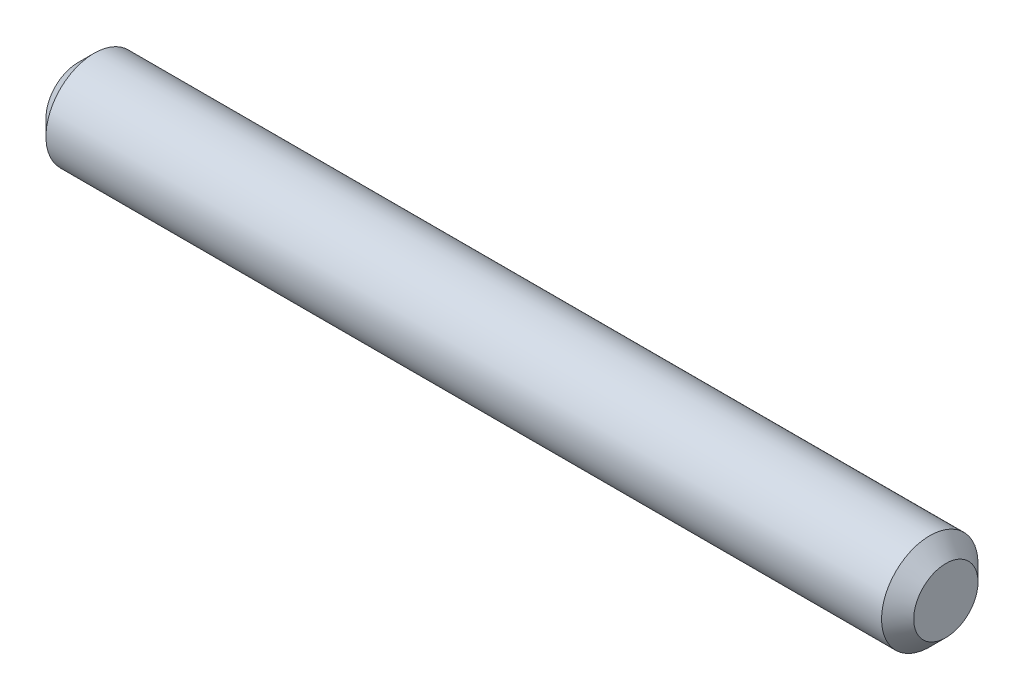
ISO-10303-21;
HEADER;
FILE_DESCRIPTION(('STEP AP214'),'2;1');
FILE_NAME('part.step','',(''),(''),'','','');
FILE_SCHEMA(('AUTOMOTIVE_DESIGN { 1 0 10303 214 1 1 1 1 }'));
ENDSEC;
DATA;
#1=APPLICATION_CONTEXT('core data for automotive mechanical design processes');
#2=APPLICATION_PROTOCOL_DEFINITION('international standard','automotive_design',2000,#1);
#3=PRODUCT_CONTEXT('',#1,'mechanical');
#4=PRODUCT('Part','Part','',(#3));
#5=PRODUCT_RELATED_PRODUCT_CATEGORY('part','',(#4));
#6=PRODUCT_DEFINITION_FORMATION('','',#4);
#7=PRODUCT_DEFINITION_CONTEXT('part definition',#1,'design');
#8=PRODUCT_DEFINITION('design','',#6,#7);
#9=PRODUCT_DEFINITION_SHAPE('','',#8);
#10=(LENGTH_UNIT() NAMED_UNIT(*) SI_UNIT(.MILLI.,.METRE.));
#11=(NAMED_UNIT(*) PLANE_ANGLE_UNIT() SI_UNIT($,.RADIAN.));
#12=(NAMED_UNIT(*) SI_UNIT($,.STERADIAN.) SOLID_ANGLE_UNIT());
#13=UNCERTAINTY_MEASURE_WITH_UNIT(LENGTH_MEASURE(1.E-05),#10,'distance_accuracy_value','');
#14=(GEOMETRIC_REPRESENTATION_CONTEXT(3) GLOBAL_UNCERTAINTY_ASSIGNED_CONTEXT((#13)) GLOBAL_UNIT_ASSIGNED_CONTEXT((#10,
#11,#12)) REPRESENTATION_CONTEXT('',''));
#15=CARTESIAN_POINT('',(0.,0.,0.));
#16=DIRECTION('',(0.,0.,1.));
#17=DIRECTION('',(1.,0.,0.));
#18=AXIS2_PLACEMENT_3D('',#15,#16,#17);
#19=CARTESIAN_POINT('',(54.,0.,0.));
#20=DIRECTION('',(-1.,0.,0.));
#21=DIRECTION('',(0.,0.,1.));
#22=AXIS2_PLACEMENT_3D('',#19,#20,#21);
#23=CYLINDRICAL_SURFACE('',#22,3.);
#24=CARTESIAN_POINT('',(1.00000000000001,0.,0.));
#25=DIRECTION('',(1.,0.,0.));
#26=DIRECTION('',(0.,0.,-1.));
#27=AXIS2_PLACEMENT_3D('',#24,#25,#26);
#28=CIRCLE('',#27,3.);
#29=CARTESIAN_POINT('',(1.00000000000001,0.,-3.));
#30=VERTEX_POINT('',#29);
#31=EDGE_CURVE('E50',#30,#30,#28,.T.);
#32=ORIENTED_EDGE('',*,*,#31,.T.);
#33=EDGE_LOOP('',(#32));
#34=FACE_BOUND('',#33,.T.);
#35=CARTESIAN_POINT('',(53.,0.,0.));
#36=DIRECTION('',(1.,0.,0.));
#37=DIRECTION('',(0.,0.,-1.));
#38=AXIS2_PLACEMENT_3D('',#35,#36,#37);
#39=CIRCLE('',#38,3.);
#40=CARTESIAN_POINT('',(53.,0.,-3.));
#41=VERTEX_POINT('',#40);
#42=EDGE_CURVE('E54',#41,#41,#39,.F.);
#43=ORIENTED_EDGE('',*,*,#42,.T.);
#44=EDGE_LOOP('',(#43));
#45=FACE_BOUND('',#44,.T.);
#46=ADVANCED_FACE('F38',(#34,#45),#23,.T.);
#47=CARTESIAN_POINT('',(54.,0.,0.));
#48=DIRECTION('',(1.,0.,0.));
#49=DIRECTION('',(0.,0.,-1.));
#50=AXIS2_PLACEMENT_3D('',#47,#48,#49);
#51=PLANE('',#50);
#52=CARTESIAN_POINT('',(54.,0.,0.));
#53=DIRECTION('',(1.,0.,0.));
#54=DIRECTION('',(0.,0.,-1.));
#55=AXIS2_PLACEMENT_3D('',#52,#53,#54);
#56=CIRCLE('',#55,2.);
#57=CARTESIAN_POINT('',(54.,0.,-2.));
#58=VERTEX_POINT('',#57);
#59=EDGE_CURVE('E10',#58,#58,#56,.T.);
#60=ORIENTED_EDGE('',*,*,#59,.T.);
#61=EDGE_LOOP('',(#60));
#62=FACE_BOUND('',#61,.T.);
#63=ADVANCED_FACE('F70',(#62),#51,.T.);
#64=CARTESIAN_POINT('',(0.,0.,0.));
#65=DIRECTION('',(1.,0.,0.));
#66=DIRECTION('',(0.,0.,-1.));
#67=AXIS2_PLACEMENT_3D('',#64,#65,#66);
#68=PLANE('',#67);
#69=CARTESIAN_POINT('',(0.,0.,0.));
#70=DIRECTION('',(1.,0.,0.));
#71=DIRECTION('',(0.,0.,-1.));
#72=AXIS2_PLACEMENT_3D('',#69,#70,#71);
#73=CIRCLE('',#72,1.99999999999999);
#74=CARTESIAN_POINT('',(0.,0.,-1.99999999999999));
#75=VERTEX_POINT('',#74);
#76=EDGE_CURVE('E46',#75,#75,#73,.F.);
#77=ORIENTED_EDGE('',*,*,#76,.T.);
#78=EDGE_LOOP('',(#77));
#79=FACE_BOUND('',#78,.T.);
#80=ADVANCED_FACE('F67',(#79),#68,.F.);
#81=CARTESIAN_POINT('',(1.00000000000001,0.,0.));
#82=DIRECTION('',(1.,0.,0.));
#83=DIRECTION('',(0.,0.,-1.));
#84=AXIS2_PLACEMENT_3D('',#81,#82,#83);
#85=CONICAL_SURFACE('',#84,3.,0.78539816339745);
#86=ORIENTED_EDGE('',*,*,#76,.F.);
#87=EDGE_LOOP('',(#86));
#88=FACE_BOUND('',#87,.T.);
#89=ORIENTED_EDGE('',*,*,#31,.F.);
#90=EDGE_LOOP('',(#89));
#91=FACE_BOUND('',#90,.T.);
#92=ADVANCED_FACE('F63',(#88,#91),#85,.T.);
#93=CARTESIAN_POINT('',(54.,0.,0.));
#94=DIRECTION('',(-1.,0.,0.));
#95=DIRECTION('',(0.,0.,1.));
#96=AXIS2_PLACEMENT_3D('',#93,#94,#95);
#97=CONICAL_SURFACE('',#96,2.,0.785398163397447);
#98=ORIENTED_EDGE('',*,*,#42,.F.);
#99=EDGE_LOOP('',(#98));
#100=FACE_BOUND('',#99,.T.);
#101=ORIENTED_EDGE('',*,*,#59,.F.);
#102=EDGE_LOOP('',(#101));
#103=FACE_BOUND('',#102,.T.);
#104=ADVANCED_FACE('F41',(#100,#103),#97,.T.);
#105=CLOSED_SHELL('',(#46,#63,#80,#92,#104));
#106=MANIFOLD_SOLID_BREP('B2',#105);
#107=ADVANCED_BREP_SHAPE_REPRESENTATION('',(#18,#106),#14);
#108=SHAPE_DEFINITION_REPRESENTATION(#9,#107);
ENDSEC;
END-ISO-10303-21;
